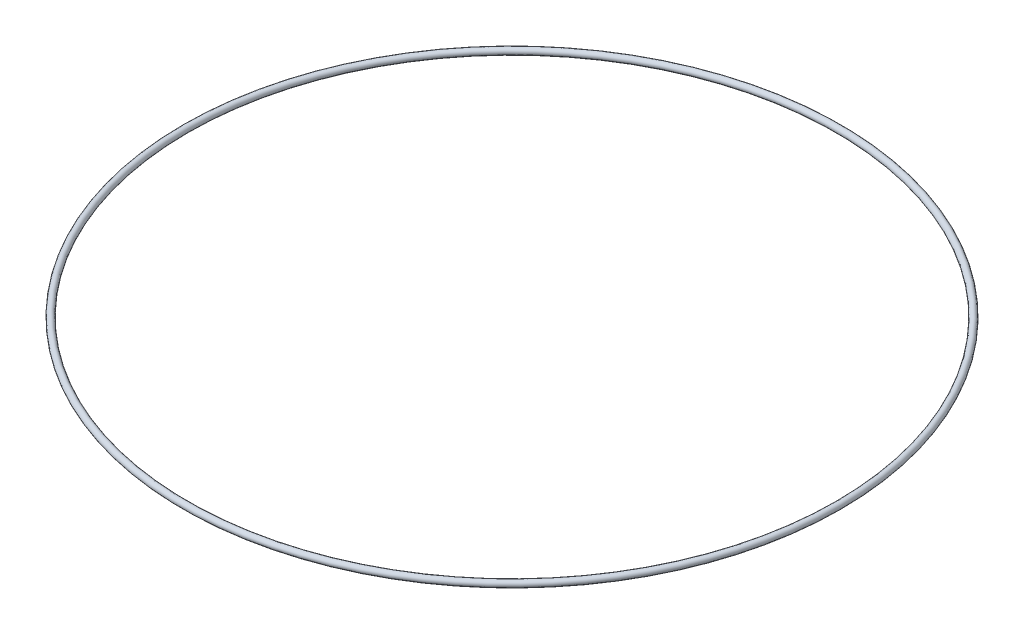
ISO-10303-21;
HEADER;
FILE_DESCRIPTION(('STEP AP214'),'2;1');
FILE_NAME('part.step','',(''),(''),'','','');
FILE_SCHEMA(('AUTOMOTIVE_DESIGN { 1 0 10303 214 1 1 1 1 }'));
ENDSEC;
DATA;
#1=APPLICATION_CONTEXT('core data for automotive mechanical design processes');
#2=APPLICATION_PROTOCOL_DEFINITION('international standard','automotive_design',2000,#1);
#3=PRODUCT_CONTEXT('',#1,'mechanical');
#4=PRODUCT('Part','Part','',(#3));
#5=PRODUCT_RELATED_PRODUCT_CATEGORY('part','',(#4));
#6=PRODUCT_DEFINITION_FORMATION('','',#4);
#7=PRODUCT_DEFINITION_CONTEXT('part definition',#1,'design');
#8=PRODUCT_DEFINITION('design','',#6,#7);
#9=PRODUCT_DEFINITION_SHAPE('','',#8);
#10=(LENGTH_UNIT() NAMED_UNIT(*) SI_UNIT(.MILLI.,.METRE.));
#11=(NAMED_UNIT(*) PLANE_ANGLE_UNIT() SI_UNIT($,.RADIAN.));
#12=(NAMED_UNIT(*) SI_UNIT($,.STERADIAN.) SOLID_ANGLE_UNIT());
#13=UNCERTAINTY_MEASURE_WITH_UNIT(LENGTH_MEASURE(1.E-05),#10,'distance_accuracy_value','');
#14=(GEOMETRIC_REPRESENTATION_CONTEXT(3) GLOBAL_UNCERTAINTY_ASSIGNED_CONTEXT((#13)) GLOBAL_UNIT_ASSIGNED_CONTEXT((#10,
#11,#12)) REPRESENTATION_CONTEXT('',''));
#15=CARTESIAN_POINT('',(0.,0.,0.));
#16=DIRECTION('',(0.,0.,1.));
#17=DIRECTION('',(1.,0.,0.));
#18=AXIS2_PLACEMENT_3D('',#15,#16,#17);
#19=CARTESIAN_POINT('',(0.,0.,0.));
#20=DIRECTION('',(0.,1.,0.));
#21=DIRECTION('',(0.,0.,1.));
#22=AXIS2_PLACEMENT_3D('',#19,#20,#21);
#23=TOROIDAL_SURFACE('',#22,127.,1.27);
#24=CARTESIAN_POINT('',(-127.,0.,0.));
#25=DIRECTION('',(0.,0.,1.));
#26=DIRECTION('',(1.,0.,0.));
#27=AXIS2_PLACEMENT_3D('',#24,#25,#26);
#28=CIRCLE('',#27,1.27);
#29=CARTESIAN_POINT('',(-128.27,0.,0.));
#30=VERTEX_POINT('',#29);
#31=EDGE_CURVE('E10',#30,#30,#28,.T.);
#32=CARTESIAN_POINT('',(0.,0.,0.));
#33=DIRECTION('',(0.,1.,0.));
#34=DIRECTION('',(0.,0.,1.));
#35=AXIS2_PLACEMENT_3D('',#32,#33,#34);
#36=CIRCLE('',#35,128.27);
#37=EDGE_CURVE('',#30,#30,#36,.T.);
#38=ORIENTED_EDGE('',*,*,#31,.T.);
#39=ORIENTED_EDGE('',*,*,#31,.F.);
#40=ORIENTED_EDGE('',*,*,#37,.T.);
#41=ORIENTED_EDGE('',*,*,#37,.F.);
#42=EDGE_LOOP('',(#38,#40,#39,#41));
#43=FACE_BOUND('',#42,.T.);
#44=ADVANCED_FACE('F32',(#43),#23,.T.);
#45=CLOSED_SHELL('',(#44));
#46=MANIFOLD_SOLID_BREP('B2',#45);
#47=ADVANCED_BREP_SHAPE_REPRESENTATION('',(#18,#46),#14);
#48=SHAPE_DEFINITION_REPRESENTATION(#9,#47);
ENDSEC;
END-ISO-10303-21;
